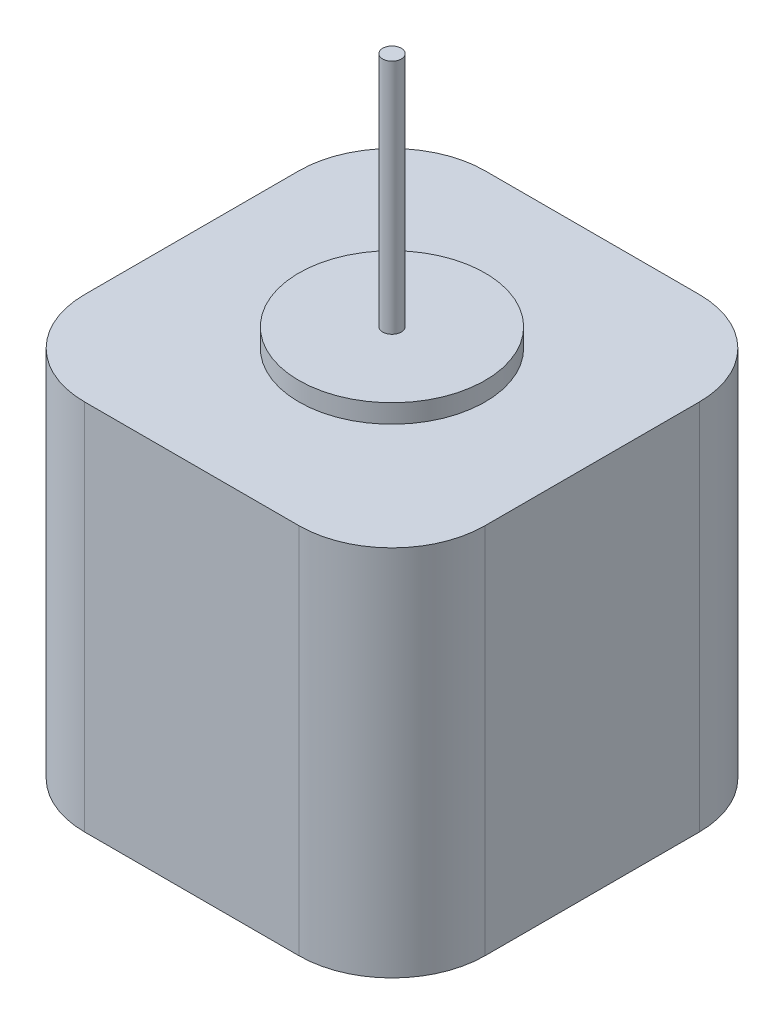
ISO-10303-21;
HEADER;
FILE_DESCRIPTION(('STEP AP214'),'2;1');
FILE_NAME('part.step','',(''),(''),'','','');
FILE_SCHEMA(('AUTOMOTIVE_DESIGN { 1 0 10303 214 1 1 1 1 }'));
ENDSEC;
DATA;
#1=APPLICATION_CONTEXT('core data for automotive mechanical design processes');
#2=APPLICATION_PROTOCOL_DEFINITION('international standard','automotive_design',2000,#1);
#3=PRODUCT_CONTEXT('',#1,'mechanical');
#4=PRODUCT('Part','Part','',(#3));
#5=PRODUCT_RELATED_PRODUCT_CATEGORY('part','',(#4));
#6=PRODUCT_DEFINITION_FORMATION('','',#4);
#7=PRODUCT_DEFINITION_CONTEXT('part definition',#1,'design');
#8=PRODUCT_DEFINITION('design','',#6,#7);
#9=PRODUCT_DEFINITION_SHAPE('','',#8);
#10=(LENGTH_UNIT() NAMED_UNIT(*) SI_UNIT(.MILLI.,.METRE.));
#11=(NAMED_UNIT(*) PLANE_ANGLE_UNIT() SI_UNIT($,.RADIAN.));
#12=(NAMED_UNIT(*) SI_UNIT($,.STERADIAN.) SOLID_ANGLE_UNIT());
#13=UNCERTAINTY_MEASURE_WITH_UNIT(LENGTH_MEASURE(1.E-05),#10,'distance_accuracy_value','');
#14=(GEOMETRIC_REPRESENTATION_CONTEXT(3) GLOBAL_UNCERTAINTY_ASSIGNED_CONTEXT((#13)) GLOBAL_UNIT_ASSIGNED_CONTEXT((#10,
#11,#12)) REPRESENTATION_CONTEXT('',''));
#15=CARTESIAN_POINT('',(0.,0.,0.));
#16=DIRECTION('',(0.,0.,1.));
#17=DIRECTION('',(1.,0.,0.));
#18=AXIS2_PLACEMENT_3D('',#15,#16,#17);
#19=CARTESIAN_POINT('',(11.5,40.,-11.5));
#20=DIRECTION('',(0.,-1.,0.));
#21=DIRECTION('',(0.,0.,-1.));
#22=AXIS2_PLACEMENT_3D('',#19,#20,#21);
#23=CYLINDRICAL_SURFACE('',#22,10.);
#24=CARTESIAN_POINT('',(11.5,0.,-11.5));
#25=DIRECTION('',(0.,1.,0.));
#26=DIRECTION('',(0.,0.,-1.));
#27=AXIS2_PLACEMENT_3D('',#24,#25,#26);
#28=CIRCLE('',#27,10.);
#29=CARTESIAN_POINT('',(21.5,0.,-11.4999999999999));
#30=VERTEX_POINT('',#29);
#31=CARTESIAN_POINT('',(11.4999999999999,0.,-21.5));
#32=VERTEX_POINT('',#31);
#33=EDGE_CURVE('E136',#30,#32,#28,.T.);
#34=ORIENTED_EDGE('',*,*,#33,.T.);
#35=DIRECTION('',(0.,-1.,0.));
#36=VECTOR('',#35,1.);
#37=CARTESIAN_POINT('',(11.4999999999999,40.,-21.5));
#38=LINE('',#37,#36);
#39=CARTESIAN_POINT('',(11.4999999999999,40.,-21.5));
#40=VERTEX_POINT('',#39);
#41=EDGE_CURVE('E41',#40,#32,#38,.T.);
#42=ORIENTED_EDGE('',*,*,#41,.F.);
#43=CARTESIAN_POINT('',(11.5,40.,-11.5));
#44=DIRECTION('',(0.,1.,0.));
#45=DIRECTION('',(0.,0.,-1.));
#46=AXIS2_PLACEMENT_3D('',#43,#44,#45);
#47=CIRCLE('',#46,10.);
#48=CARTESIAN_POINT('',(21.5,40.,-11.4999999999999));
#49=VERTEX_POINT('',#48);
#50=EDGE_CURVE('E151',#49,#40,#47,.T.);
#51=ORIENTED_EDGE('',*,*,#50,.F.);
#52=DIRECTION('',(0.,-1.,0.));
#53=VECTOR('',#52,1.);
#54=CARTESIAN_POINT('',(21.5,40.,-11.4999999999999));
#55=LINE('',#54,#53);
#56=EDGE_CURVE('E132',#49,#30,#55,.T.);
#57=ORIENTED_EDGE('',*,*,#56,.T.);
#58=EDGE_LOOP('',(#34,#42,#51,#57));
#59=FACE_BOUND('',#58,.T.);
#60=ADVANCED_FACE('F38',(#59),#23,.T.);
#61=CARTESIAN_POINT('',(11.4999999999999,40.,-21.5));
#62=DIRECTION('',(0.,0.,1.));
#63=DIRECTION('',(1.,0.,0.));
#64=AXIS2_PLACEMENT_3D('',#61,#62,#63);
#65=PLANE('',#64);
#66=DIRECTION('',(-1.,0.,0.));
#67=VECTOR('',#66,1.);
#68=CARTESIAN_POINT('',(11.4999999999999,0.,-21.5));
#69=LINE('',#68,#67);
#70=CARTESIAN_POINT('',(-11.4999999999999,0.,-21.5));
#71=VERTEX_POINT('',#70);
#72=EDGE_CURVE('E139',#32,#71,#69,.T.);
#73=ORIENTED_EDGE('',*,*,#72,.T.);
#74=DIRECTION('',(0.,-1.,0.));
#75=VECTOR('',#74,1.);
#76=CARTESIAN_POINT('',(-11.4999999999999,40.,-21.5));
#77=LINE('',#76,#75);
#78=CARTESIAN_POINT('',(-11.4999999999999,40.,-21.5));
#79=VERTEX_POINT('',#78);
#80=EDGE_CURVE('E160',#79,#71,#77,.T.);
#81=ORIENTED_EDGE('',*,*,#80,.F.);
#82=DIRECTION('',(-1.,0.,0.));
#83=VECTOR('',#82,1.);
#84=CARTESIAN_POINT('',(11.4999999999999,40.,-21.5));
#85=LINE('',#84,#83);
#86=EDGE_CURVE('E99',#40,#79,#85,.T.);
#87=ORIENTED_EDGE('',*,*,#86,.F.);
#88=ORIENTED_EDGE('',*,*,#41,.T.);
#89=EDGE_LOOP('',(#73,#81,#87,#88));
#90=FACE_BOUND('',#89,.T.);
#91=ADVANCED_FACE('F166',(#90),#65,.F.);
#92=CARTESIAN_POINT('',(-11.5,40.,-11.5));
#93=DIRECTION('',(0.,-1.,0.));
#94=DIRECTION('',(0.,0.,-1.));
#95=AXIS2_PLACEMENT_3D('',#92,#93,#94);
#96=CYLINDRICAL_SURFACE('',#95,10.);
#97=CARTESIAN_POINT('',(-11.5,0.,-11.5));
#98=DIRECTION('',(0.,1.,0.));
#99=DIRECTION('',(0.,0.,1.));
#100=AXIS2_PLACEMENT_3D('',#97,#98,#99);
#101=CIRCLE('',#100,10.);
#102=CARTESIAN_POINT('',(-21.5,0.,-11.4999999999999));
#103=VERTEX_POINT('',#102);
#104=EDGE_CURVE('E142',#71,#103,#101,.T.);
#105=ORIENTED_EDGE('',*,*,#104,.T.);
#106=DIRECTION('',(0.,-1.,0.));
#107=VECTOR('',#106,1.);
#108=CARTESIAN_POINT('',(-21.5,40.,-11.4999999999999));
#109=LINE('',#108,#107);
#110=CARTESIAN_POINT('',(-21.5,40.,-11.4999999999999));
#111=VERTEX_POINT('',#110);
#112=EDGE_CURVE('E158',#111,#103,#109,.T.);
#113=ORIENTED_EDGE('',*,*,#112,.F.);
#114=CARTESIAN_POINT('',(-11.5,40.,-11.5));
#115=DIRECTION('',(0.,1.,0.));
#116=DIRECTION('',(0.,0.,1.));
#117=AXIS2_PLACEMENT_3D('',#114,#115,#116);
#118=CIRCLE('',#117,10.);
#119=EDGE_CURVE('E181',#79,#111,#118,.T.);
#120=ORIENTED_EDGE('',*,*,#119,.F.);
#121=ORIENTED_EDGE('',*,*,#80,.T.);
#122=EDGE_LOOP('',(#105,#113,#120,#121));
#123=FACE_BOUND('',#122,.T.);
#124=ADVANCED_FACE('F175',(#123),#96,.T.);
#125=CARTESIAN_POINT('',(-21.5,40.,-11.4999999999999));
#126=DIRECTION('',(1.,0.,0.));
#127=DIRECTION('',(0.,0.,-1.));
#128=AXIS2_PLACEMENT_3D('',#125,#126,#127);
#129=PLANE('',#128);
#130=DIRECTION('',(0.,0.,1.));
#131=VECTOR('',#130,1.);
#132=CARTESIAN_POINT('',(-21.5,0.,-11.4999999999999));
#133=LINE('',#132,#131);
#134=CARTESIAN_POINT('',(-21.5,0.,11.4999999999999));
#135=VERTEX_POINT('',#134);
#136=EDGE_CURVE('E144',#103,#135,#133,.T.);
#137=ORIENTED_EDGE('',*,*,#136,.T.);
#138=DIRECTION('',(0.,-1.,0.));
#139=VECTOR('',#138,1.);
#140=CARTESIAN_POINT('',(-21.5,40.,11.4999999999999));
#141=LINE('',#140,#139);
#142=CARTESIAN_POINT('',(-21.5,40.,11.4999999999999));
#143=VERTEX_POINT('',#142);
#144=EDGE_CURVE('E155',#143,#135,#141,.T.);
#145=ORIENTED_EDGE('',*,*,#144,.F.);
#146=DIRECTION('',(0.,0.,1.));
#147=VECTOR('',#146,1.);
#148=CARTESIAN_POINT('',(-21.5,40.,-11.4999999999999));
#149=LINE('',#148,#147);
#150=EDGE_CURVE('E180',#111,#143,#149,.T.);
#151=ORIENTED_EDGE('',*,*,#150,.F.);
#152=ORIENTED_EDGE('',*,*,#112,.T.);
#153=EDGE_LOOP('',(#137,#145,#151,#152));
#154=FACE_BOUND('',#153,.T.);
#155=ADVANCED_FACE('F178',(#154),#129,.F.);
#156=CARTESIAN_POINT('',(-11.5,40.,11.5));
#157=DIRECTION('',(0.,-1.,0.));
#158=DIRECTION('',(0.,0.,-1.));
#159=AXIS2_PLACEMENT_3D('',#156,#157,#158);
#160=CYLINDRICAL_SURFACE('',#159,10.);
#161=CARTESIAN_POINT('',(-11.5,0.,11.5));
#162=DIRECTION('',(0.,1.,0.));
#163=DIRECTION('',(0.,0.,-1.));
#164=AXIS2_PLACEMENT_3D('',#161,#162,#163);
#165=CIRCLE('',#164,10.);
#166=CARTESIAN_POINT('',(-11.4999999999999,0.,21.5));
#167=VERTEX_POINT('',#166);
#168=EDGE_CURVE('E146',#135,#167,#165,.T.);
#169=ORIENTED_EDGE('',*,*,#168,.T.);
#170=DIRECTION('',(0.,-1.,0.));
#171=VECTOR('',#170,1.);
#172=CARTESIAN_POINT('',(-11.4999999999999,40.,21.5));
#173=LINE('',#172,#171);
#174=CARTESIAN_POINT('',(-11.4999999999999,40.,21.5));
#175=VERTEX_POINT('',#174);
#176=EDGE_CURVE('E127',#175,#167,#173,.T.);
#177=ORIENTED_EDGE('',*,*,#176,.F.);
#178=CARTESIAN_POINT('',(-11.5,40.,11.5));
#179=DIRECTION('',(0.,1.,0.));
#180=DIRECTION('',(0.,0.,-1.));
#181=AXIS2_PLACEMENT_3D('',#178,#179,#180);
#182=CIRCLE('',#181,10.);
#183=EDGE_CURVE('E118',#143,#175,#182,.T.);
#184=ORIENTED_EDGE('',*,*,#183,.F.);
#185=ORIENTED_EDGE('',*,*,#144,.T.);
#186=EDGE_LOOP('',(#169,#177,#184,#185));
#187=FACE_BOUND('',#186,.T.);
#188=ADVANCED_FACE('F236',(#187),#160,.T.);
#189=CARTESIAN_POINT('',(11.4999999999999,40.,21.5));
#190=DIRECTION('',(0.,0.,-1.));
#191=DIRECTION('',(-1.,0.,0.));
#192=AXIS2_PLACEMENT_3D('',#189,#190,#191);
#193=PLANE('',#192);
#194=DIRECTION('',(1.,0.,0.));
#195=VECTOR('',#194,1.);
#196=CARTESIAN_POINT('',(11.4999999999999,0.,21.5));
#197=LINE('',#196,#195);
#198=CARTESIAN_POINT('',(11.4999999999999,0.,21.5));
#199=VERTEX_POINT('',#198);
#200=EDGE_CURVE('E126',#167,#199,#197,.T.);
#201=ORIENTED_EDGE('',*,*,#200,.T.);
#202=DIRECTION('',(0.,-1.,0.));
#203=VECTOR('',#202,1.);
#204=CARTESIAN_POINT('',(11.4999999999999,40.,21.5));
#205=LINE('',#204,#203);
#206=CARTESIAN_POINT('',(11.4999999999999,40.,21.5));
#207=VERTEX_POINT('',#206);
#208=EDGE_CURVE('E123',#207,#199,#205,.T.);
#209=ORIENTED_EDGE('',*,*,#208,.F.);
#210=DIRECTION('',(1.,0.,0.));
#211=VECTOR('',#210,1.);
#212=CARTESIAN_POINT('',(11.4999999999999,40.,21.5));
#213=LINE('',#212,#211);
#214=EDGE_CURVE('E112',#175,#207,#213,.T.);
#215=ORIENTED_EDGE('',*,*,#214,.F.);
#216=ORIENTED_EDGE('',*,*,#176,.T.);
#217=EDGE_LOOP('',(#201,#209,#215,#216));
#218=FACE_BOUND('',#217,.T.);
#219=ADVANCED_FACE('F124',(#218),#193,.F.);
#220=CARTESIAN_POINT('',(11.5,40.,11.5));
#221=DIRECTION('',(0.,-1.,0.));
#222=DIRECTION('',(0.,0.,-1.));
#223=AXIS2_PLACEMENT_3D('',#220,#221,#222);
#224=CYLINDRICAL_SURFACE('',#223,10.);
#225=CARTESIAN_POINT('',(11.5,0.,11.5));
#226=DIRECTION('',(0.,1.,0.));
#227=DIRECTION('',(0.,0.,-1.));
#228=AXIS2_PLACEMENT_3D('',#225,#226,#227);
#229=CIRCLE('',#228,10.);
#230=CARTESIAN_POINT('',(21.5,0.,11.4999999999999));
#231=VERTEX_POINT('',#230);
#232=EDGE_CURVE('E84',#199,#231,#229,.T.);
#233=ORIENTED_EDGE('',*,*,#232,.T.);
#234=DIRECTION('',(0.,-1.,0.));
#235=VECTOR('',#234,1.);
#236=CARTESIAN_POINT('',(21.5,40.,11.4999999999999));
#237=LINE('',#236,#235);
#238=CARTESIAN_POINT('',(21.5,40.,11.4999999999999));
#239=VERTEX_POINT('',#238);
#240=EDGE_CURVE('E128',#239,#231,#237,.T.);
#241=ORIENTED_EDGE('',*,*,#240,.F.);
#242=CARTESIAN_POINT('',(11.5,40.,11.5));
#243=DIRECTION('',(0.,1.,0.));
#244=DIRECTION('',(0.,0.,-1.));
#245=AXIS2_PLACEMENT_3D('',#242,#243,#244);
#246=CIRCLE('',#245,10.);
#247=EDGE_CURVE('E116',#207,#239,#246,.T.);
#248=ORIENTED_EDGE('',*,*,#247,.F.);
#249=ORIENTED_EDGE('',*,*,#208,.T.);
#250=EDGE_LOOP('',(#233,#241,#248,#249));
#251=FACE_BOUND('',#250,.T.);
#252=ADVANCED_FACE('F130',(#251),#224,.T.);
#253=CARTESIAN_POINT('',(21.5,40.,-11.4999999999999));
#254=DIRECTION('',(-1.,0.,0.));
#255=DIRECTION('',(0.,0.,1.));
#256=AXIS2_PLACEMENT_3D('',#253,#254,#255);
#257=PLANE('',#256);
#258=DIRECTION('',(0.,0.,-1.));
#259=VECTOR('',#258,1.);
#260=CARTESIAN_POINT('',(21.5,0.,-11.4999999999999));
#261=LINE('',#260,#259);
#262=EDGE_CURVE('E90',#231,#30,#261,.T.);
#263=ORIENTED_EDGE('',*,*,#262,.T.);
#264=ORIENTED_EDGE('',*,*,#56,.F.);
#265=DIRECTION('',(0.,0.,-1.));
#266=VECTOR('',#265,1.);
#267=CARTESIAN_POINT('',(21.5,40.,-11.4999999999999));
#268=LINE('',#267,#266);
#269=EDGE_CURVE('E55',#239,#49,#268,.T.);
#270=ORIENTED_EDGE('',*,*,#269,.F.);
#271=ORIENTED_EDGE('',*,*,#240,.T.);
#272=EDGE_LOOP('',(#263,#264,#270,#271));
#273=FACE_BOUND('',#272,.T.);
#274=ADVANCED_FACE('F217',(#273),#257,.F.);
#275=CARTESIAN_POINT('',(11.5,40.,-11.5));
#276=DIRECTION('',(0.,-1.,0.));
#277=DIRECTION('',(0.,0.,-1.));
#278=AXIS2_PLACEMENT_3D('',#275,#276,#277);
#279=PLANE('',#278);
#280=CARTESIAN_POINT('',(0.,40.,0.));
#281=DIRECTION('',(0.,1.,0.));
#282=DIRECTION('',(0.,0.,1.));
#283=AXIS2_PLACEMENT_3D('',#280,#281,#282);
#284=CIRCLE('',#283,10.);
#285=CARTESIAN_POINT('',(0.,40.,10.));
#286=VERTEX_POINT('',#285);
#287=EDGE_CURVE('E11',#286,#286,#284,.T.);
#288=ORIENTED_EDGE('',*,*,#287,.F.);
#289=EDGE_LOOP('',(#288));
#290=FACE_BOUND('',#289,.T.);
#291=ORIENTED_EDGE('',*,*,#50,.T.);
#292=ORIENTED_EDGE('',*,*,#86,.T.);
#293=ORIENTED_EDGE('',*,*,#119,.T.);
#294=ORIENTED_EDGE('',*,*,#150,.T.);
#295=ORIENTED_EDGE('',*,*,#183,.T.);
#296=ORIENTED_EDGE('',*,*,#214,.T.);
#297=ORIENTED_EDGE('',*,*,#247,.T.);
#298=ORIENTED_EDGE('',*,*,#269,.T.);
#299=EDGE_LOOP('',(#291,#292,#293,#294,#295,#296,#297,#298));
#300=FACE_BOUND('',#299,.T.);
#301=ADVANCED_FACE('F114',(#290,#300),#279,.F.);
#302=CARTESIAN_POINT('',(11.5,0.,-11.5));
#303=DIRECTION('',(0.,-1.,0.));
#304=DIRECTION('',(0.,0.,-1.));
#305=AXIS2_PLACEMENT_3D('',#302,#303,#304);
#306=PLANE('',#305);
#307=ORIENTED_EDGE('',*,*,#33,.F.);
#308=ORIENTED_EDGE('',*,*,#262,.F.);
#309=ORIENTED_EDGE('',*,*,#232,.F.);
#310=ORIENTED_EDGE('',*,*,#200,.F.);
#311=ORIENTED_EDGE('',*,*,#168,.F.);
#312=ORIENTED_EDGE('',*,*,#136,.F.);
#313=ORIENTED_EDGE('',*,*,#104,.F.);
#314=ORIENTED_EDGE('',*,*,#72,.F.);
#315=EDGE_LOOP('',(#307,#308,#309,#310,#311,#312,#313,#314));
#316=FACE_BOUND('',#315,.T.);
#317=ADVANCED_FACE('F171',(#316),#306,.T.);
#318=CARTESIAN_POINT('',(0.,42.,0.));
#319=DIRECTION('',(0.,-1.,0.));
#320=DIRECTION('',(0.,0.,-1.));
#321=AXIS2_PLACEMENT_3D('',#318,#319,#320);
#322=CYLINDRICAL_SURFACE('',#321,10.);
#323=CARTESIAN_POINT('',(0.,42.,0.));
#324=DIRECTION('',(0.,1.,0.));
#325=DIRECTION('',(0.,0.,1.));
#326=AXIS2_PLACEMENT_3D('',#323,#324,#325);
#327=CIRCLE('',#326,10.);
#328=CARTESIAN_POINT('',(0.,42.,10.));
#329=VERTEX_POINT('',#328);
#330=EDGE_CURVE('E140',#329,#329,#327,.T.);
#331=ORIENTED_EDGE('',*,*,#330,.F.);
#332=EDGE_LOOP('',(#331));
#333=FACE_BOUND('',#332,.T.);
#334=ORIENTED_EDGE('',*,*,#287,.T.);
#335=EDGE_LOOP('',(#334));
#336=FACE_BOUND('',#335,.T.);
#337=ADVANCED_FACE('F207',(#333,#336),#322,.T.);
#338=CARTESIAN_POINT('',(0.,42.,0.));
#339=DIRECTION('',(0.,1.,0.));
#340=DIRECTION('',(0.,0.,1.));
#341=AXIS2_PLACEMENT_3D('',#338,#339,#340);
#342=PLANE('',#341);
#343=CARTESIAN_POINT('',(0.,42.,0.));
#344=DIRECTION('',(0.,1.,0.));
#345=DIRECTION('',(0.,0.,1.));
#346=AXIS2_PLACEMENT_3D('',#343,#344,#345);
#347=CIRCLE('',#346,1.);
#348=CARTESIAN_POINT('',(0.,42.,1.));
#349=VERTEX_POINT('',#348);
#350=EDGE_CURVE('E190',#349,#349,#347,.T.);
#351=ORIENTED_EDGE('',*,*,#350,.F.);
#352=EDGE_LOOP('',(#351));
#353=FACE_BOUND('',#352,.T.);
#354=ORIENTED_EDGE('',*,*,#330,.T.);
#355=EDGE_LOOP('',(#354));
#356=FACE_BOUND('',#355,.T.);
#357=ADVANCED_FACE('F201',(#353,#356),#342,.T.);
#358=CARTESIAN_POINT('',(0.,67.4,0.));
#359=DIRECTION('',(0.,-1.,0.));
#360=DIRECTION('',(0.,0.,-1.));
#361=AXIS2_PLACEMENT_3D('',#358,#359,#360);
#362=CYLINDRICAL_SURFACE('',#361,1.);
#363=CARTESIAN_POINT('',(0.,67.4,0.));
#364=DIRECTION('',(0.,1.,0.));
#365=DIRECTION('',(0.,0.,1.));
#366=AXIS2_PLACEMENT_3D('',#363,#364,#365);
#367=CIRCLE('',#366,1.);
#368=CARTESIAN_POINT('',(0.,67.4,1.));
#369=VERTEX_POINT('',#368);
#370=EDGE_CURVE('E189',#369,#369,#367,.T.);
#371=ORIENTED_EDGE('',*,*,#370,.F.);
#372=EDGE_LOOP('',(#371));
#373=FACE_BOUND('',#372,.T.);
#374=ORIENTED_EDGE('',*,*,#350,.T.);
#375=EDGE_LOOP('',(#374));
#376=FACE_BOUND('',#375,.T.);
#377=ADVANCED_FACE('F198',(#373,#376),#362,.T.);
#378=CARTESIAN_POINT('',(0.,67.4,0.));
#379=DIRECTION('',(0.,1.,0.));
#380=DIRECTION('',(0.,0.,1.));
#381=AXIS2_PLACEMENT_3D('',#378,#379,#380);
#382=PLANE('',#381);
#383=ORIENTED_EDGE('',*,*,#370,.T.);
#384=EDGE_LOOP('',(#383));
#385=FACE_BOUND('',#384,.T.);
#386=ADVANCED_FACE('F196',(#385),#382,.T.);
#387=CLOSED_SHELL('',(#60,#91,#124,#155,#188,#219,#252,#274,#301,#317,#337,#357,#377,#386));
#388=MANIFOLD_SOLID_BREP('B2',#387);
#389=ADVANCED_BREP_SHAPE_REPRESENTATION('',(#18,#388),#14);
#390=SHAPE_DEFINITION_REPRESENTATION(#9,#389);
ENDSEC;
END-ISO-10303-21;
